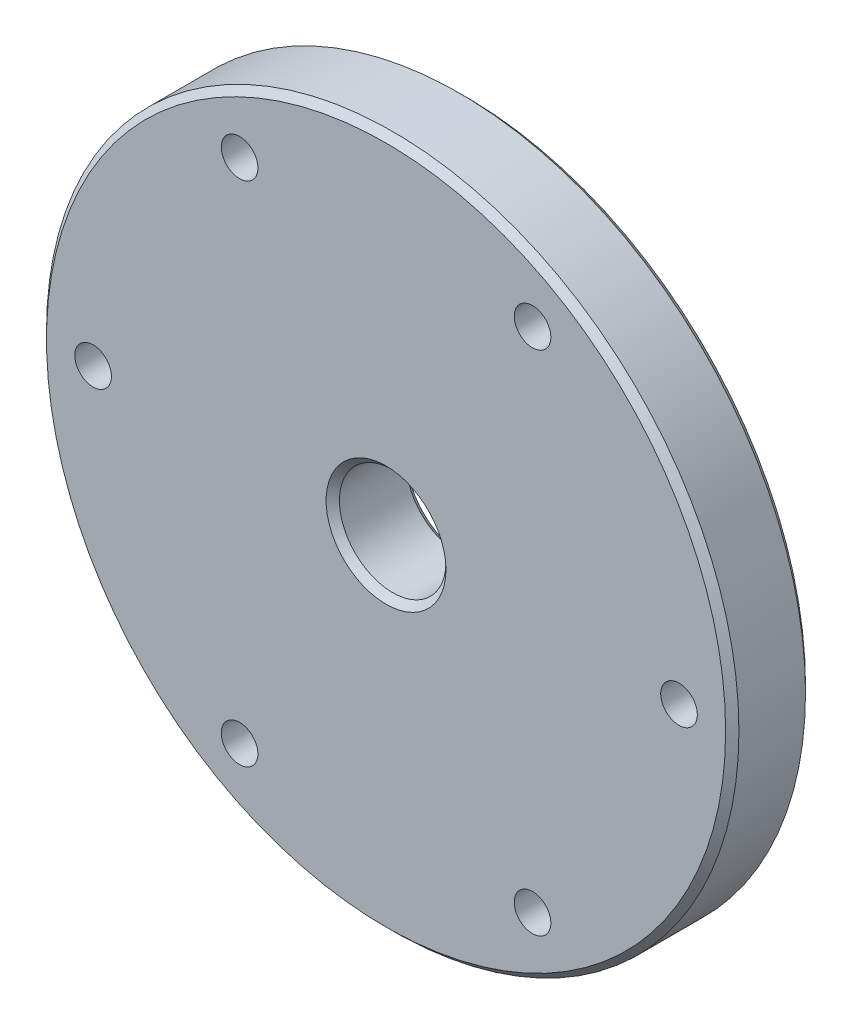
ISO-10303-21;
HEADER;
FILE_DESCRIPTION(('STEP AP214'),'2;1');
FILE_NAME('part.step','',(''),(''),'','','');
FILE_SCHEMA(('AUTOMOTIVE_DESIGN { 1 0 10303 214 1 1 1 1 }'));
ENDSEC;
DATA;
#1=APPLICATION_CONTEXT('core data for automotive mechanical design processes');
#2=APPLICATION_PROTOCOL_DEFINITION('international standard','automotive_design',2000,#1);
#3=PRODUCT_CONTEXT('',#1,'mechanical');
#4=PRODUCT('Part','Part','',(#3));
#5=PRODUCT_RELATED_PRODUCT_CATEGORY('part','',(#4));
#6=PRODUCT_DEFINITION_FORMATION('','',#4);
#7=PRODUCT_DEFINITION_CONTEXT('part definition',#1,'design');
#8=PRODUCT_DEFINITION('design','',#6,#7);
#9=PRODUCT_DEFINITION_SHAPE('','',#8);
#10=(LENGTH_UNIT() NAMED_UNIT(*) SI_UNIT(.MILLI.,.METRE.));
#11=(NAMED_UNIT(*) PLANE_ANGLE_UNIT() SI_UNIT($,.RADIAN.));
#12=(NAMED_UNIT(*) SI_UNIT($,.STERADIAN.) SOLID_ANGLE_UNIT());
#13=UNCERTAINTY_MEASURE_WITH_UNIT(LENGTH_MEASURE(1.E-05),#10,'distance_accuracy_value','');
#14=(GEOMETRIC_REPRESENTATION_CONTEXT(3) GLOBAL_UNCERTAINTY_ASSIGNED_CONTEXT((#13)) GLOBAL_UNIT_ASSIGNED_CONTEXT((#10,
#11,#12)) REPRESENTATION_CONTEXT('',''));
#15=CARTESIAN_POINT('',(0.,0.,0.));
#16=DIRECTION('',(0.,0.,1.));
#17=DIRECTION('',(1.,0.,0.));
#18=AXIS2_PLACEMENT_3D('',#15,#16,#17);
#19=CARTESIAN_POINT('',(0.,0.,0.));
#20=DIRECTION('',(0.,0.,1.));
#21=DIRECTION('',(1.,0.,0.));
#22=AXIS2_PLACEMENT_3D('',#19,#20,#21);
#23=PLANE('',#22);
#24=CARTESIAN_POINT('',(0.,0.,0.));
#25=DIRECTION('',(0.,0.,-1.));
#26=DIRECTION('',(-1.,0.,0.));
#27=AXIS2_PLACEMENT_3D('',#24,#25,#26);
#28=CIRCLE('',#27,20.);
#29=CARTESIAN_POINT('',(-20.,0.,0.));
#30=VERTEX_POINT('',#29);
#31=EDGE_CURVE('E116',#30,#30,#28,.T.);
#32=ORIENTED_EDGE('',*,*,#31,.F.);
#33=EDGE_LOOP('',(#32));
#34=FACE_BOUND('',#33,.T.);
#35=CARTESIAN_POINT('',(0.,0.,0.));
#36=DIRECTION('',(0.,0.,1.));
#37=DIRECTION('',(1.,0.,0.));
#38=AXIS2_PLACEMENT_3D('',#35,#36,#37);
#39=CIRCLE('',#38,33.1);
#40=CARTESIAN_POINT('',(33.1,0.,0.));
#41=VERTEX_POINT('',#40);
#42=EDGE_CURVE('E126',#41,#41,#39,.T.);
#43=ORIENTED_EDGE('',*,*,#42,.F.);
#44=EDGE_LOOP('',(#43));
#45=FACE_BOUND('',#44,.T.);
#46=ADVANCED_FACE('F41',(#34,#45),#23,.F.);
#47=CARTESIAN_POINT('',(0.,0.,0.));
#48=DIRECTION('',(0.,0.,1.));
#49=DIRECTION('',(1.,0.,0.));
#50=AXIS2_PLACEMENT_3D('',#47,#48,#49);
#51=CIRCLE('',#50,36.9);
#52=CARTESIAN_POINT('',(36.9,0.,0.));
#53=VERTEX_POINT('',#52);
#54=EDGE_CURVE('E120',#53,#53,#51,.T.);
#55=ORIENTED_EDGE('',*,*,#54,.T.);
#56=EDGE_LOOP('',(#55));
#57=FACE_BOUND('',#56,.T.);
#58=CARTESIAN_POINT('',(0.,0.,0.));
#59=DIRECTION('',(0.,0.,1.));
#60=DIRECTION('',(1.,0.,0.));
#61=AXIS2_PLACEMENT_3D('',#58,#59,#60);
#62=CIRCLE('',#61,51.);
#63=CARTESIAN_POINT('',(51.,0.,0.));
#64=VERTEX_POINT('',#63);
#65=EDGE_CURVE('E71',#64,#64,#62,.F.);
#66=ORIENTED_EDGE('',*,*,#65,.T.);
#67=EDGE_LOOP('',(#66));
#68=FACE_BOUND('',#67,.T.);
#69=CARTESIAN_POINT('',(22.,38.1051,0.));
#70=DIRECTION('',(0.,0.,1.));
#71=DIRECTION('',(1.,0.,0.));
#72=AXIS2_PLACEMENT_3D('',#69,#70,#71);
#73=CIRCLE('',#72,2.75);
#74=CARTESIAN_POINT('',(24.75,38.1051,0.));
#75=VERTEX_POINT('',#74);
#76=EDGE_CURVE('E97',#75,#75,#73,.T.);
#77=ORIENTED_EDGE('',*,*,#76,.T.);
#78=EDGE_LOOP('',(#77));
#79=FACE_BOUND('',#78,.T.);
#80=CARTESIAN_POINT('',(-22.,38.1051,0.));
#81=DIRECTION('',(0.,0.,1.));
#82=DIRECTION('',(1.,0.,0.));
#83=AXIS2_PLACEMENT_3D('',#80,#81,#82);
#84=CIRCLE('',#83,2.75);
#85=CARTESIAN_POINT('',(-19.25,38.1051,0.));
#86=VERTEX_POINT('',#85);
#87=EDGE_CURVE('E91',#86,#86,#84,.T.);
#88=ORIENTED_EDGE('',*,*,#87,.T.);
#89=EDGE_LOOP('',(#88));
#90=FACE_BOUND('',#89,.T.);
#91=CARTESIAN_POINT('',(-44.,0.,0.));
#92=DIRECTION('',(0.,0.,1.));
#93=DIRECTION('',(1.,0.,0.));
#94=AXIS2_PLACEMENT_3D('',#91,#92,#93);
#95=CIRCLE('',#94,2.75);
#96=CARTESIAN_POINT('',(-41.25,0.,0.));
#97=VERTEX_POINT('',#96);
#98=EDGE_CURVE('E85',#97,#97,#95,.T.);
#99=ORIENTED_EDGE('',*,*,#98,.T.);
#100=EDGE_LOOP('',(#99));
#101=FACE_BOUND('',#100,.T.);
#102=CARTESIAN_POINT('',(-22.,-38.1051,0.));
#103=DIRECTION('',(0.,0.,1.));
#104=DIRECTION('',(1.,0.,0.));
#105=AXIS2_PLACEMENT_3D('',#102,#103,#104);
#106=CIRCLE('',#105,2.75);
#107=CARTESIAN_POINT('',(-19.25,-38.1051,0.));
#108=VERTEX_POINT('',#107);
#109=EDGE_CURVE('E78',#108,#108,#106,.T.);
#110=ORIENTED_EDGE('',*,*,#109,.T.);
#111=EDGE_LOOP('',(#110));
#112=FACE_BOUND('',#111,.T.);
#113=CARTESIAN_POINT('',(22.,-38.1051,0.));
#114=DIRECTION('',(0.,0.,1.));
#115=DIRECTION('',(1.,0.,0.));
#116=AXIS2_PLACEMENT_3D('',#113,#114,#115);
#117=CIRCLE('',#116,2.75);
#118=CARTESIAN_POINT('',(24.75,-38.1051,0.));
#119=VERTEX_POINT('',#118);
#120=EDGE_CURVE('E79',#119,#119,#117,.T.);
#121=ORIENTED_EDGE('',*,*,#120,.T.);
#122=EDGE_LOOP('',(#121));
#123=FACE_BOUND('',#122,.T.);
#124=CARTESIAN_POINT('',(44.,0.,0.));
#125=DIRECTION('',(0.,0.,1.));
#126=DIRECTION('',(1.,0.,0.));
#127=AXIS2_PLACEMENT_3D('',#124,#125,#126);
#128=CIRCLE('',#127,2.75);
#129=CARTESIAN_POINT('',(46.75,0.,0.));
#130=VERTEX_POINT('',#129);
#131=EDGE_CURVE('E100',#130,#130,#128,.T.);
#132=ORIENTED_EDGE('',*,*,#131,.T.);
#133=EDGE_LOOP('',(#132));
#134=FACE_BOUND('',#133,.T.);
#135=ADVANCED_FACE('F142',(#57,#68,#79,#90,#101,#112,#123,#134),#23,.F.);
#136=CARTESIAN_POINT('',(0.,0.,0.));
#137=DIRECTION('',(0.,0.,1.));
#138=DIRECTION('',(1.,0.,0.));
#139=AXIS2_PLACEMENT_3D('',#136,#137,#138);
#140=CIRCLE('',#139,8.99999999999999);
#141=CARTESIAN_POINT('',(8.99999999999999,0.,0.));
#142=VERTEX_POINT('',#141);
#143=EDGE_CURVE('E68',#142,#142,#140,.T.);
#144=ORIENTED_EDGE('',*,*,#143,.T.);
#145=EDGE_LOOP('',(#144));
#146=FACE_BOUND('',#145,.T.);
#147=CARTESIAN_POINT('',(0.,0.,0.));
#148=DIRECTION('',(0.,0.,-1.));
#149=DIRECTION('',(-1.,0.,0.));
#150=AXIS2_PLACEMENT_3D('',#147,#148,#149);
#151=CIRCLE('',#150,10.);
#152=CARTESIAN_POINT('',(-10.,0.,0.));
#153=VERTEX_POINT('',#152);
#154=EDGE_CURVE('E113',#153,#153,#151,.T.);
#155=ORIENTED_EDGE('',*,*,#154,.T.);
#156=EDGE_LOOP('',(#155));
#157=FACE_BOUND('',#156,.T.);
#158=ADVANCED_FACE('F145',(#146,#157),#23,.F.);
#159=CARTESIAN_POINT('',(0.,0.,12.));
#160=DIRECTION('',(0.,0.,-1.));
#161=DIRECTION('',(-1.,0.,0.));
#162=AXIS2_PLACEMENT_3D('',#159,#160,#161);
#163=CYLINDRICAL_SURFACE('',#162,52.);
#164=CARTESIAN_POINT('',(0.,0.,1.00000000000001));
#165=DIRECTION('',(0.,0.,1.));
#166=DIRECTION('',(1.,0.,0.));
#167=AXIS2_PLACEMENT_3D('',#164,#165,#166);
#168=CIRCLE('',#167,52.);
#169=CARTESIAN_POINT('',(52.,0.,1.00000000000001));
#170=VERTEX_POINT('',#169);
#171=EDGE_CURVE('E10',#170,#170,#168,.T.);
#172=ORIENTED_EDGE('',*,*,#171,.T.);
#173=EDGE_LOOP('',(#172));
#174=FACE_BOUND('',#173,.T.);
#175=CARTESIAN_POINT('',(0.,0.,11.));
#176=DIRECTION('',(0.,0.,1.));
#177=DIRECTION('',(1.,0.,0.));
#178=AXIS2_PLACEMENT_3D('',#175,#176,#177);
#179=CIRCLE('',#178,52.);
#180=CARTESIAN_POINT('',(52.,0.,11.));
#181=VERTEX_POINT('',#180);
#182=EDGE_CURVE('E49',#181,#181,#179,.F.);
#183=ORIENTED_EDGE('',*,*,#182,.T.);
#184=EDGE_LOOP('',(#183));
#185=FACE_BOUND('',#184,.T.);
#186=ADVANCED_FACE('F155',(#174,#185),#163,.T.);
#187=CARTESIAN_POINT('',(0.,0.,12.));
#188=DIRECTION('',(0.,0.,1.));
#189=DIRECTION('',(1.,0.,0.));
#190=AXIS2_PLACEMENT_3D('',#187,#188,#189);
#191=PLANE('',#190);
#192=CARTESIAN_POINT('',(44.,0.,12.));
#193=DIRECTION('',(0.,0.,1.));
#194=DIRECTION('',(1.,0.,0.));
#195=AXIS2_PLACEMENT_3D('',#192,#193,#194);
#196=CIRCLE('',#195,2.75);
#197=CARTESIAN_POINT('',(46.75,0.,12.));
#198=VERTEX_POINT('',#197);
#199=EDGE_CURVE('E74',#198,#198,#196,.T.);
#200=ORIENTED_EDGE('',*,*,#199,.F.);
#201=EDGE_LOOP('',(#200));
#202=FACE_BOUND('',#201,.T.);
#203=CARTESIAN_POINT('',(22.,-38.1051,12.));
#204=DIRECTION('',(0.,0.,1.));
#205=DIRECTION('',(1.,0.,0.));
#206=AXIS2_PLACEMENT_3D('',#203,#204,#205);
#207=CIRCLE('',#206,2.75);
#208=CARTESIAN_POINT('',(24.75,-38.1051,12.));
#209=VERTEX_POINT('',#208);
#210=EDGE_CURVE('E101',#209,#209,#207,.T.);
#211=ORIENTED_EDGE('',*,*,#210,.F.);
#212=EDGE_LOOP('',(#211));
#213=FACE_BOUND('',#212,.T.);
#214=CARTESIAN_POINT('',(-22.,-38.1051,12.));
#215=DIRECTION('',(0.,0.,1.));
#216=DIRECTION('',(1.,0.,0.));
#217=AXIS2_PLACEMENT_3D('',#214,#215,#216);
#218=CIRCLE('',#217,2.75);
#219=CARTESIAN_POINT('',(-19.25,-38.1051,12.));
#220=VERTEX_POINT('',#219);
#221=EDGE_CURVE('E75',#220,#220,#218,.T.);
#222=ORIENTED_EDGE('',*,*,#221,.F.);
#223=EDGE_LOOP('',(#222));
#224=FACE_BOUND('',#223,.T.);
#225=CARTESIAN_POINT('',(-44.,0.,12.));
#226=DIRECTION('',(0.,0.,1.));
#227=DIRECTION('',(1.,0.,0.));
#228=AXIS2_PLACEMENT_3D('',#225,#226,#227);
#229=CIRCLE('',#228,2.75);
#230=CARTESIAN_POINT('',(-41.25,0.,12.));
#231=VERTEX_POINT('',#230);
#232=EDGE_CURVE('E82',#231,#231,#229,.T.);
#233=ORIENTED_EDGE('',*,*,#232,.F.);
#234=EDGE_LOOP('',(#233));
#235=FACE_BOUND('',#234,.T.);
#236=CARTESIAN_POINT('',(-22.,38.1051,12.));
#237=DIRECTION('',(0.,0.,1.));
#238=DIRECTION('',(1.,0.,0.));
#239=AXIS2_PLACEMENT_3D('',#236,#237,#238);
#240=CIRCLE('',#239,2.75);
#241=CARTESIAN_POINT('',(-19.25,38.1051,12.));
#242=VERTEX_POINT('',#241);
#243=EDGE_CURVE('E88',#242,#242,#240,.T.);
#244=ORIENTED_EDGE('',*,*,#243,.F.);
#245=EDGE_LOOP('',(#244));
#246=FACE_BOUND('',#245,.T.);
#247=CARTESIAN_POINT('',(22.,38.1051,12.));
#248=DIRECTION('',(0.,0.,1.));
#249=DIRECTION('',(1.,0.,0.));
#250=AXIS2_PLACEMENT_3D('',#247,#248,#249);
#251=CIRCLE('',#250,2.75);
#252=CARTESIAN_POINT('',(24.75,38.1051,12.));
#253=VERTEX_POINT('',#252);
#254=EDGE_CURVE('E94',#253,#253,#251,.T.);
#255=ORIENTED_EDGE('',*,*,#254,.F.);
#256=EDGE_LOOP('',(#255));
#257=FACE_BOUND('',#256,.T.);
#258=CARTESIAN_POINT('',(0.,0.,12.));
#259=DIRECTION('',(0.,0.,1.));
#260=DIRECTION('',(1.,0.,0.));
#261=AXIS2_PLACEMENT_3D('',#258,#259,#260);
#262=CIRCLE('',#261,8.99999999999998);
#263=CARTESIAN_POINT('',(8.99999999999998,0.,12.));
#264=VERTEX_POINT('',#263);
#265=EDGE_CURVE('E53',#264,#264,#262,.F.);
#266=ORIENTED_EDGE('',*,*,#265,.T.);
#267=EDGE_LOOP('',(#266));
#268=FACE_BOUND('',#267,.T.);
#269=CARTESIAN_POINT('',(0.,0.,12.));
#270=DIRECTION('',(0.,0.,1.));
#271=DIRECTION('',(1.,0.,0.));
#272=AXIS2_PLACEMENT_3D('',#269,#270,#271);
#273=CIRCLE('',#272,51.);
#274=CARTESIAN_POINT('',(51.,0.,12.));
#275=VERTEX_POINT('',#274);
#276=EDGE_CURVE('E57',#275,#275,#273,.T.);
#277=ORIENTED_EDGE('',*,*,#276,.T.);
#278=EDGE_LOOP('',(#277));
#279=FACE_BOUND('',#278,.T.);
#280=ADVANCED_FACE('F162',(#202,#213,#224,#235,#246,#257,#268,#279),#191,.T.);
#281=CARTESIAN_POINT('',(0.,0.,12.));
#282=DIRECTION('',(0.,0.,-1.));
#283=DIRECTION('',(-1.,0.,0.));
#284=AXIS2_PLACEMENT_3D('',#281,#282,#283);
#285=CYLINDRICAL_SURFACE('',#284,8.);
#286=CARTESIAN_POINT('',(0.,0.,0.999999999999994));
#287=DIRECTION('',(0.,0.,1.));
#288=DIRECTION('',(1.,0.,0.));
#289=AXIS2_PLACEMENT_3D('',#286,#287,#288);
#290=CIRCLE('',#289,8.);
#291=CARTESIAN_POINT('',(8.,0.,0.999999999999994));
#292=VERTEX_POINT('',#291);
#293=EDGE_CURVE('E62',#292,#292,#290,.F.);
#294=ORIENTED_EDGE('',*,*,#293,.T.);
#295=EDGE_LOOP('',(#294));
#296=FACE_BOUND('',#295,.T.);
#297=CARTESIAN_POINT('',(0.,0.,11.));
#298=DIRECTION('',(0.,0.,1.));
#299=DIRECTION('',(1.,0.,0.));
#300=AXIS2_PLACEMENT_3D('',#297,#298,#299);
#301=CIRCLE('',#300,8.);
#302=CARTESIAN_POINT('',(8.,0.,11.));
#303=VERTEX_POINT('',#302);
#304=EDGE_CURVE('E65',#303,#303,#301,.T.);
#305=ORIENTED_EDGE('',*,*,#304,.T.);
#306=EDGE_LOOP('',(#305));
#307=FACE_BOUND('',#306,.T.);
#308=ADVANCED_FACE('F203',(#296,#307),#285,.F.);
#309=CARTESIAN_POINT('',(0.,0.,0.));
#310=DIRECTION('',(0.,0.,-1.));
#311=DIRECTION('',(-1.,0.,0.));
#312=AXIS2_PLACEMENT_3D('',#309,#310,#311);
#313=CONICAL_SURFACE('',#312,8.99999999999999,0.785398163397448);
#314=ORIENTED_EDGE('',*,*,#293,.F.);
#315=EDGE_LOOP('',(#314));
#316=FACE_BOUND('',#315,.T.);
#317=ORIENTED_EDGE('',*,*,#143,.F.);
#318=EDGE_LOOP('',(#317));
#319=FACE_BOUND('',#318,.T.);
#320=ADVANCED_FACE('F205',(#316,#319),#313,.F.);
#321=CARTESIAN_POINT('',(0.,0.,11.));
#322=DIRECTION('',(0.,0.,1.));
#323=DIRECTION('',(1.,0.,0.));
#324=AXIS2_PLACEMENT_3D('',#321,#322,#323);
#325=CONICAL_SURFACE('',#324,8.,0.785398163397455);
#326=ORIENTED_EDGE('',*,*,#265,.F.);
#327=EDGE_LOOP('',(#326));
#328=FACE_BOUND('',#327,.T.);
#329=ORIENTED_EDGE('',*,*,#304,.F.);
#330=EDGE_LOOP('',(#329));
#331=FACE_BOUND('',#330,.T.);
#332=ADVANCED_FACE('F233',(#328,#331),#325,.F.);
#333=CARTESIAN_POINT('',(0.,0.,1.00000000000001));
#334=DIRECTION('',(0.,0.,1.));
#335=DIRECTION('',(1.,0.,0.));
#336=AXIS2_PLACEMENT_3D('',#333,#334,#335);
#337=CONICAL_SURFACE('',#336,52.,0.785398163397445);
#338=ORIENTED_EDGE('',*,*,#65,.F.);
#339=EDGE_LOOP('',(#338));
#340=FACE_BOUND('',#339,.T.);
#341=ORIENTED_EDGE('',*,*,#171,.F.);
#342=EDGE_LOOP('',(#341));
#343=FACE_BOUND('',#342,.T.);
#344=ADVANCED_FACE('F228',(#340,#343),#337,.T.);
#345=CARTESIAN_POINT('',(0.,0.,12.));
#346=DIRECTION('',(0.,0.,-1.));
#347=DIRECTION('',(-1.,0.,0.));
#348=AXIS2_PLACEMENT_3D('',#345,#346,#347);
#349=CONICAL_SURFACE('',#348,51.,0.785398163397448);
#350=ORIENTED_EDGE('',*,*,#182,.F.);
#351=EDGE_LOOP('',(#350));
#352=FACE_BOUND('',#351,.T.);
#353=ORIENTED_EDGE('',*,*,#276,.F.);
#354=EDGE_LOOP('',(#353));
#355=FACE_BOUND('',#354,.T.);
#356=ADVANCED_FACE('F44',(#352,#355),#349,.T.);
#357=CARTESIAN_POINT('',(22.,38.1051,12.));
#358=DIRECTION('',(0.,0.,-1.));
#359=DIRECTION('',(-1.,0.,0.));
#360=AXIS2_PLACEMENT_3D('',#357,#358,#359);
#361=CYLINDRICAL_SURFACE('',#360,2.75);
#362=ORIENTED_EDGE('',*,*,#254,.T.);
#363=EDGE_LOOP('',(#362));
#364=FACE_BOUND('',#363,.T.);
#365=ORIENTED_EDGE('',*,*,#76,.F.);
#366=EDGE_LOOP('',(#365));
#367=FACE_BOUND('',#366,.T.);
#368=ADVANCED_FACE('F188',(#364,#367),#361,.F.);
#369=CARTESIAN_POINT('',(-22.,38.1051,12.));
#370=DIRECTION('',(0.,0.,-1.));
#371=DIRECTION('',(-1.,0.,0.));
#372=AXIS2_PLACEMENT_3D('',#369,#370,#371);
#373=CYLINDRICAL_SURFACE('',#372,2.75);
#374=ORIENTED_EDGE('',*,*,#243,.T.);
#375=EDGE_LOOP('',(#374));
#376=FACE_BOUND('',#375,.T.);
#377=ORIENTED_EDGE('',*,*,#87,.F.);
#378=EDGE_LOOP('',(#377));
#379=FACE_BOUND('',#378,.T.);
#380=ADVANCED_FACE('F191',(#376,#379),#373,.F.);
#381=CARTESIAN_POINT('',(-44.,0.,12.));
#382=DIRECTION('',(0.,0.,-1.));
#383=DIRECTION('',(-1.,0.,0.));
#384=AXIS2_PLACEMENT_3D('',#381,#382,#383);
#385=CYLINDRICAL_SURFACE('',#384,2.75);
#386=ORIENTED_EDGE('',*,*,#232,.T.);
#387=EDGE_LOOP('',(#386));
#388=FACE_BOUND('',#387,.T.);
#389=ORIENTED_EDGE('',*,*,#98,.F.);
#390=EDGE_LOOP('',(#389));
#391=FACE_BOUND('',#390,.T.);
#392=ADVANCED_FACE('F195',(#388,#391),#385,.F.);
#393=CARTESIAN_POINT('',(-22.,-38.1051,12.));
#394=DIRECTION('',(0.,0.,-1.));
#395=DIRECTION('',(-1.,0.,0.));
#396=AXIS2_PLACEMENT_3D('',#393,#394,#395);
#397=CYLINDRICAL_SURFACE('',#396,2.75);
#398=ORIENTED_EDGE('',*,*,#221,.T.);
#399=EDGE_LOOP('',(#398));
#400=FACE_BOUND('',#399,.T.);
#401=ORIENTED_EDGE('',*,*,#109,.F.);
#402=EDGE_LOOP('',(#401));
#403=FACE_BOUND('',#402,.T.);
#404=ADVANCED_FACE('F186',(#400,#403),#397,.F.);
#405=CARTESIAN_POINT('',(22.,-38.1051,12.));
#406=DIRECTION('',(0.,0.,-1.));
#407=DIRECTION('',(-1.,0.,0.));
#408=AXIS2_PLACEMENT_3D('',#405,#406,#407);
#409=CYLINDRICAL_SURFACE('',#408,2.75);
#410=ORIENTED_EDGE('',*,*,#210,.T.);
#411=EDGE_LOOP('',(#410));
#412=FACE_BOUND('',#411,.T.);
#413=ORIENTED_EDGE('',*,*,#120,.F.);
#414=EDGE_LOOP('',(#413));
#415=FACE_BOUND('',#414,.T.);
#416=ADVANCED_FACE('F182',(#412,#415),#409,.F.);
#417=CARTESIAN_POINT('',(44.,0.,12.));
#418=DIRECTION('',(0.,0.,-1.));
#419=DIRECTION('',(-1.,0.,0.));
#420=AXIS2_PLACEMENT_3D('',#417,#418,#419);
#421=CYLINDRICAL_SURFACE('',#420,2.75);
#422=ORIENTED_EDGE('',*,*,#199,.T.);
#423=EDGE_LOOP('',(#422));
#424=FACE_BOUND('',#423,.T.);
#425=ORIENTED_EDGE('',*,*,#131,.F.);
#426=EDGE_LOOP('',(#425));
#427=FACE_BOUND('',#426,.T.);
#428=ADVANCED_FACE('F176',(#424,#427),#421,.F.);
#429=CARTESIAN_POINT('',(0.,0.,-34.6379458038435));
#430=DIRECTION('',(0.,0.,-1.));
#431=DIRECTION('',(-1.,0.,0.));
#432=AXIS2_PLACEMENT_3D('',#429,#430,#431);
#433=DEGENERATE_TOROIDAL_SURFACE('',#432,0.00132244772438686,39.9966797790753,.T.);
#434=ORIENTED_EDGE('',*,*,#31,.T.);
#435=EDGE_LOOP('',(#434));
#436=FACE_BOUND('',#435,.T.);
#437=CARTESIAN_POINT('',(0.,0.,4.0888));
#438=DIRECTION('',(0.,0.,-1.));
#439=DIRECTION('',(-1.,0.,0.));
#440=AXIS2_PLACEMENT_3D('',#437,#438,#439);
#441=CIRCLE('',#440,10.);
#442=CARTESIAN_POINT('',(-10.,0.,4.0888));
#443=VERTEX_POINT('',#442);
#444=EDGE_CURVE('E104',#443,#443,#441,.T.);
#445=ORIENTED_EDGE('',*,*,#444,.F.);
#446=EDGE_LOOP('',(#445));
#447=FACE_BOUND('',#446,.T.);
#448=ADVANCED_FACE('F168',(#436,#447),#433,.F.);
#449=CARTESIAN_POINT('',(0.,0.,0.));
#450=DIRECTION('',(0.,0.,-1.));
#451=DIRECTION('',(-1.,0.,0.));
#452=AXIS2_PLACEMENT_3D('',#449,#450,#451);
#453=CYLINDRICAL_SURFACE('',#452,10.);
#454=ORIENTED_EDGE('',*,*,#444,.T.);
#455=EDGE_LOOP('',(#454));
#456=FACE_BOUND('',#455,.T.);
#457=ORIENTED_EDGE('',*,*,#154,.F.);
#458=EDGE_LOOP('',(#457));
#459=FACE_BOUND('',#458,.T.);
#460=ADVANCED_FACE('F167',(#456,#459),#453,.T.);
#461=CARTESIAN_POINT('',(0.,0.,2.4));
#462=DIRECTION('',(0.,0.,1.));
#463=DIRECTION('',(1.,0.,0.));
#464=AXIS2_PLACEMENT_3D('',#461,#462,#463);
#465=PLANE('',#464);
#466=CARTESIAN_POINT('',(0.,0.,2.4));
#467=DIRECTION('',(0.,0.,1.));
#468=DIRECTION('',(1.,0.,0.));
#469=AXIS2_PLACEMENT_3D('',#466,#467,#468);
#470=CIRCLE('',#469,36.9);
#471=CARTESIAN_POINT('',(36.9,0.,2.4));
#472=VERTEX_POINT('',#471);
#473=EDGE_CURVE('E119',#472,#472,#470,.T.);
#474=ORIENTED_EDGE('',*,*,#473,.F.);
#475=EDGE_LOOP('',(#474));
#476=FACE_BOUND('',#475,.T.);
#477=CARTESIAN_POINT('',(0.,0.,2.4));
#478=DIRECTION('',(0.,0.,1.));
#479=DIRECTION('',(1.,0.,0.));
#480=AXIS2_PLACEMENT_3D('',#477,#478,#479);
#481=CIRCLE('',#480,33.1);
#482=CARTESIAN_POINT('',(33.1,0.,2.4));
#483=VERTEX_POINT('',#482);
#484=EDGE_CURVE('E123',#483,#483,#481,.T.);
#485=ORIENTED_EDGE('',*,*,#484,.T.);
#486=EDGE_LOOP('',(#485));
#487=FACE_BOUND('',#486,.T.);
#488=ADVANCED_FACE('F132',(#476,#487),#465,.F.);
#489=CARTESIAN_POINT('',(0.,0.,2.4));
#490=DIRECTION('',(0.,0.,-1.));
#491=DIRECTION('',(-1.,0.,0.));
#492=AXIS2_PLACEMENT_3D('',#489,#490,#491);
#493=CYLINDRICAL_SURFACE('',#492,36.9);
#494=ORIENTED_EDGE('',*,*,#473,.T.);
#495=EDGE_LOOP('',(#494));
#496=FACE_BOUND('',#495,.T.);
#497=ORIENTED_EDGE('',*,*,#54,.F.);
#498=EDGE_LOOP('',(#497));
#499=FACE_BOUND('',#498,.T.);
#500=ADVANCED_FACE('F137',(#496,#499),#493,.F.);
#501=CARTESIAN_POINT('',(0.,0.,2.4));
#502=DIRECTION('',(0.,0.,-1.));
#503=DIRECTION('',(-1.,0.,0.));
#504=AXIS2_PLACEMENT_3D('',#501,#502,#503);
#505=CYLINDRICAL_SURFACE('',#504,33.1);
#506=ORIENTED_EDGE('',*,*,#484,.F.);
#507=EDGE_LOOP('',(#506));
#508=FACE_BOUND('',#507,.T.);
#509=ORIENTED_EDGE('',*,*,#42,.T.);
#510=EDGE_LOOP('',(#509));
#511=FACE_BOUND('',#510,.T.);
#512=ADVANCED_FACE('F134',(#508,#511),#505,.T.);
#513=CLOSED_SHELL('',(#46,#135,#158,#186,#280,#308,#320,#332,#344,#356,#368,#380,#392,#404,#416,
#428,#448,#460,#488,#500,#512));
#514=MANIFOLD_SOLID_BREP('B2',#513);
#515=ADVANCED_BREP_SHAPE_REPRESENTATION('',(#18,#514),#14);
#516=SHAPE_DEFINITION_REPRESENTATION(#9,#515);
ENDSEC;
END-ISO-10303-21;
